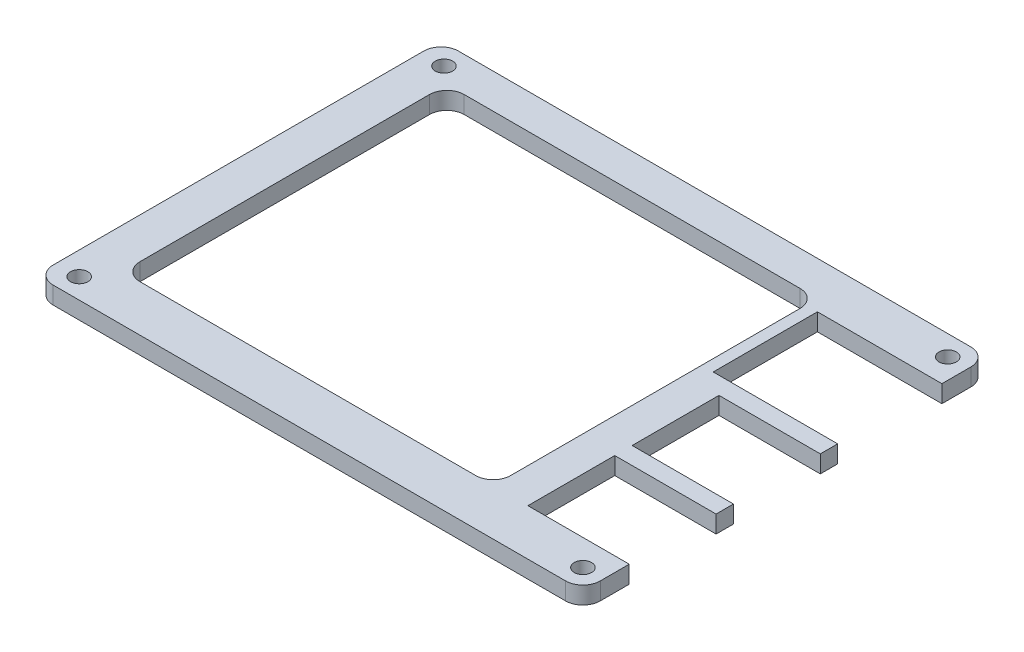
ISO-10303-21;
HEADER;
FILE_DESCRIPTION(('STEP AP214'),'2;1');
FILE_NAME('part.step','',(''),(''),'','','');
FILE_SCHEMA(('AUTOMOTIVE_DESIGN { 1 0 10303 214 1 1 1 1 }'));
ENDSEC;
DATA;
#1=APPLICATION_CONTEXT('core data for automotive mechanical design processes');
#2=APPLICATION_PROTOCOL_DEFINITION('international standard','automotive_design',2000,#1);
#3=PRODUCT_CONTEXT('',#1,'mechanical');
#4=PRODUCT('Part','Part','',(#3));
#5=PRODUCT_RELATED_PRODUCT_CATEGORY('part','',(#4));
#6=PRODUCT_DEFINITION_FORMATION('','',#4);
#7=PRODUCT_DEFINITION_CONTEXT('part definition',#1,'design');
#8=PRODUCT_DEFINITION('design','',#6,#7);
#9=PRODUCT_DEFINITION_SHAPE('','',#8);
#10=(LENGTH_UNIT() NAMED_UNIT(*) SI_UNIT(.MILLI.,.METRE.));
#11=(NAMED_UNIT(*) PLANE_ANGLE_UNIT() SI_UNIT($,.RADIAN.));
#12=(NAMED_UNIT(*) SI_UNIT($,.STERADIAN.) SOLID_ANGLE_UNIT());
#13=UNCERTAINTY_MEASURE_WITH_UNIT(LENGTH_MEASURE(1.E-05),#10,'distance_accuracy_value','');
#14=(GEOMETRIC_REPRESENTATION_CONTEXT(3) GLOBAL_UNCERTAINTY_ASSIGNED_CONTEXT((#13)) GLOBAL_UNIT_ASSIGNED_CONTEXT((#10,
#11,#12)) REPRESENTATION_CONTEXT('',''));
#15=CARTESIAN_POINT('',(0.,0.,0.));
#16=DIRECTION('',(0.,0.,1.));
#17=DIRECTION('',(1.,0.,0.));
#18=AXIS2_PLACEMENT_3D('',#15,#16,#17);
#19=CARTESIAN_POINT('',(47.25,3.,-35.));
#20=DIRECTION('',(-1.,0.,0.));
#21=DIRECTION('',(0.,0.,1.));
#22=AXIS2_PLACEMENT_3D('',#19,#20,#21);
#23=PLANE('',#22);
#24=DIRECTION('',(0.,0.,-1.));
#25=VECTOR('',#24,1.);
#26=CARTESIAN_POINT('',(47.25,0.,-35.));
#27=LINE('',#26,#25);
#28=CARTESIAN_POINT('',(47.25,0.,-5.99999999999998));
#29=VERTEX_POINT('',#28);
#30=CARTESIAN_POINT('',(47.25,0.,-8.99999999999998));
#31=VERTEX_POINT('',#30);
#32=EDGE_CURVE('E254',#29,#31,#27,.T.);
#33=ORIENTED_EDGE('',*,*,#32,.T.);
#34=DIRECTION('',(0.,1.,0.));
#35=VECTOR('',#34,1.);
#36=CARTESIAN_POINT('',(47.25,0.,-8.99999999999998));
#37=LINE('',#36,#35);
#38=CARTESIAN_POINT('',(47.25,3.,-8.99999999999998));
#39=VERTEX_POINT('',#38);
#40=EDGE_CURVE('E543',#31,#39,#37,.T.);
#41=ORIENTED_EDGE('',*,*,#40,.T.);
#42=DIRECTION('',(0.,0.,-1.));
#43=VECTOR('',#42,1.);
#44=CARTESIAN_POINT('',(47.25,3.,-35.));
#45=LINE('',#44,#43);
#46=CARTESIAN_POINT('',(47.25,3.,-5.99999999999998));
#47=VERTEX_POINT('',#46);
#48=EDGE_CURVE('E580',#47,#39,#45,.T.);
#49=ORIENTED_EDGE('',*,*,#48,.F.);
#50=DIRECTION('',(0.,1.,0.));
#51=VECTOR('',#50,1.);
#52=CARTESIAN_POINT('',(47.25,0.,-5.99999999999998));
#53=LINE('',#52,#51);
#54=EDGE_CURVE('E299',#29,#47,#53,.T.);
#55=ORIENTED_EDGE('',*,*,#54,.F.);
#56=EDGE_LOOP('',(#33,#41,#49,#55));
#57=FACE_BOUND('',#56,.T.);
#58=ADVANCED_FACE('F39',(#57),#23,.F.);
#59=CARTESIAN_POINT('',(47.25,0.,12.));
#60=VERTEX_POINT('',#59);
#61=CARTESIAN_POINT('',(47.25,0.,9.00000000000001));
#62=VERTEX_POINT('',#61);
#63=EDGE_CURVE('E261',#60,#62,#27,.T.);
#64=ORIENTED_EDGE('',*,*,#63,.T.);
#65=DIRECTION('',(0.,1.,0.));
#66=VECTOR('',#65,1.);
#67=CARTESIAN_POINT('',(47.25,0.,9.00000000000001));
#68=LINE('',#67,#66);
#69=CARTESIAN_POINT('',(47.25,3.,9.00000000000001));
#70=VERTEX_POINT('',#69);
#71=EDGE_CURVE('E285',#62,#70,#68,.T.);
#72=ORIENTED_EDGE('',*,*,#71,.T.);
#73=CARTESIAN_POINT('',(47.25,3.,12.));
#74=VERTEX_POINT('',#73);
#75=EDGE_CURVE('E392',#74,#70,#45,.T.);
#76=ORIENTED_EDGE('',*,*,#75,.F.);
#77=DIRECTION('',(0.,1.,0.));
#78=VECTOR('',#77,1.);
#79=CARTESIAN_POINT('',(47.25,0.,12.));
#80=LINE('',#79,#78);
#81=EDGE_CURVE('E287',#60,#74,#80,.T.);
#82=ORIENTED_EDGE('',*,*,#81,.F.);
#83=EDGE_LOOP('',(#64,#72,#76,#82));
#84=FACE_BOUND('',#83,.T.);
#85=ADVANCED_FACE('F283',(#84),#23,.F.);
#86=CARTESIAN_POINT('',(47.25,0.,32.));
#87=VERTEX_POINT('',#86);
#88=CARTESIAN_POINT('',(47.25,0.,27.));
#89=VERTEX_POINT('',#88);
#90=EDGE_CURVE('E257',#87,#89,#27,.T.);
#91=ORIENTED_EDGE('',*,*,#90,.T.);
#92=DIRECTION('',(0.,1.,0.));
#93=VECTOR('',#92,1.);
#94=CARTESIAN_POINT('',(47.25,0.,27.));
#95=LINE('',#94,#93);
#96=CARTESIAN_POINT('',(47.25,3.,27.));
#97=VERTEX_POINT('',#96);
#98=EDGE_CURVE('E314',#89,#97,#95,.T.);
#99=ORIENTED_EDGE('',*,*,#98,.T.);
#100=CARTESIAN_POINT('',(47.25,3.,32.));
#101=VERTEX_POINT('',#100);
#102=EDGE_CURVE('E387',#101,#97,#45,.T.);
#103=ORIENTED_EDGE('',*,*,#102,.F.);
#104=DIRECTION('',(0.,-1.,0.));
#105=VECTOR('',#104,1.);
#106=CARTESIAN_POINT('',(47.25,3.,32.));
#107=LINE('',#106,#105);
#108=EDGE_CURVE('E456',#101,#87,#107,.T.);
#109=ORIENTED_EDGE('',*,*,#108,.T.);
#110=EDGE_LOOP('',(#91,#99,#103,#109));
#111=FACE_BOUND('',#110,.T.);
#112=ADVANCED_FACE('F605',(#111),#23,.F.);
#113=CARTESIAN_POINT('',(47.25,3.,-27.));
#114=VERTEX_POINT('',#113);
#115=CARTESIAN_POINT('',(47.25,3.,-32.));
#116=VERTEX_POINT('',#115);
#117=EDGE_CURVE('E245',#114,#116,#45,.T.);
#118=ORIENTED_EDGE('',*,*,#117,.F.);
#119=DIRECTION('',(0.,1.,0.));
#120=VECTOR('',#119,1.);
#121=CARTESIAN_POINT('',(47.25,0.,-27.));
#122=LINE('',#121,#120);
#123=CARTESIAN_POINT('',(47.25,0.,-27.));
#124=VERTEX_POINT('',#123);
#125=EDGE_CURVE('E229',#124,#114,#122,.T.);
#126=ORIENTED_EDGE('',*,*,#125,.F.);
#127=CARTESIAN_POINT('',(47.25,0.,-32.));
#128=VERTEX_POINT('',#127);
#129=EDGE_CURVE('E243',#124,#128,#27,.T.);
#130=ORIENTED_EDGE('',*,*,#129,.T.);
#131=DIRECTION('',(0.,-1.,0.));
#132=VECTOR('',#131,1.);
#133=CARTESIAN_POINT('',(47.25,3.,-32.));
#134=LINE('',#133,#132);
#135=EDGE_CURVE('E459',#128,#116,#134,.F.);
#136=ORIENTED_EDGE('',*,*,#135,.T.);
#137=EDGE_LOOP('',(#118,#126,#130,#136));
#138=FACE_BOUND('',#137,.T.);
#139=ADVANCED_FACE('F241',(#138),#23,.F.);
#140=CARTESIAN_POINT('',(-47.25,3.,-35.));
#141=DIRECTION('',(0.,0.,1.));
#142=DIRECTION('',(1.,0.,0.));
#143=AXIS2_PLACEMENT_3D('',#140,#141,#142);
#144=PLANE('',#143);
#145=DIRECTION('',(-1.,0.,0.));
#146=VECTOR('',#145,1.);
#147=CARTESIAN_POINT('',(-47.25,0.,-35.));
#148=LINE('',#147,#146);
#149=CARTESIAN_POINT('',(44.25,0.,-35.));
#150=VERTEX_POINT('',#149);
#151=CARTESIAN_POINT('',(-44.25,0.,-35.));
#152=VERTEX_POINT('',#151);
#153=EDGE_CURVE('E269',#150,#152,#148,.T.);
#154=ORIENTED_EDGE('',*,*,#153,.T.);
#155=DIRECTION('',(0.,-1.,0.));
#156=VECTOR('',#155,1.);
#157=CARTESIAN_POINT('',(-44.25,3.,-35.));
#158=LINE('',#157,#156);
#159=CARTESIAN_POINT('',(-44.25,3.,-35.));
#160=VERTEX_POINT('',#159);
#161=EDGE_CURVE('E453',#152,#160,#158,.F.);
#162=ORIENTED_EDGE('',*,*,#161,.T.);
#163=DIRECTION('',(-1.,0.,0.));
#164=VECTOR('',#163,1.);
#165=CARTESIAN_POINT('',(-47.25,3.,-35.));
#166=LINE('',#165,#164);
#167=CARTESIAN_POINT('',(44.25,3.,-35.));
#168=VERTEX_POINT('',#167);
#169=EDGE_CURVE('E391',#168,#160,#166,.T.);
#170=ORIENTED_EDGE('',*,*,#169,.F.);
#171=DIRECTION('',(0.,-1.,0.));
#172=VECTOR('',#171,1.);
#173=CARTESIAN_POINT('',(44.25,3.,-35.));
#174=LINE('',#173,#172);
#175=EDGE_CURVE('E449',#168,#150,#174,.T.);
#176=ORIENTED_EDGE('',*,*,#175,.T.);
#177=EDGE_LOOP('',(#154,#162,#170,#176));
#178=FACE_BOUND('',#177,.T.);
#179=ADVANCED_FACE('F639',(#178),#144,.F.);
#180=CARTESIAN_POINT('',(-47.25,3.,-35.));
#181=DIRECTION('',(1.,0.,0.));
#182=DIRECTION('',(0.,0.,-1.));
#183=AXIS2_PLACEMENT_3D('',#180,#181,#182);
#184=PLANE('',#183);
#185=DIRECTION('',(0.,0.,1.));
#186=VECTOR('',#185,1.);
#187=CARTESIAN_POINT('',(-47.25,0.,-35.));
#188=LINE('',#187,#186);
#189=CARTESIAN_POINT('',(-47.25,0.,-32.));
#190=VERTEX_POINT('',#189);
#191=CARTESIAN_POINT('',(-47.25,0.,32.));
#192=VERTEX_POINT('',#191);
#193=EDGE_CURVE('E277',#190,#192,#188,.T.);
#194=ORIENTED_EDGE('',*,*,#193,.T.);
#195=DIRECTION('',(0.,-1.,0.));
#196=VECTOR('',#195,1.);
#197=CARTESIAN_POINT('',(-47.25,3.,32.));
#198=LINE('',#197,#196);
#199=CARTESIAN_POINT('',(-47.25,3.,32.));
#200=VERTEX_POINT('',#199);
#201=EDGE_CURVE('E434',#192,#200,#198,.F.);
#202=ORIENTED_EDGE('',*,*,#201,.T.);
#203=DIRECTION('',(0.,0.,1.));
#204=VECTOR('',#203,1.);
#205=CARTESIAN_POINT('',(-47.25,3.,-35.));
#206=LINE('',#205,#204);
#207=CARTESIAN_POINT('',(-47.25,3.,-32.));
#208=VERTEX_POINT('',#207);
#209=EDGE_CURVE('E396',#208,#200,#206,.T.);
#210=ORIENTED_EDGE('',*,*,#209,.F.);
#211=DIRECTION('',(0.,-1.,0.));
#212=VECTOR('',#211,1.);
#213=CARTESIAN_POINT('',(-47.25,3.,-32.));
#214=LINE('',#213,#212);
#215=EDGE_CURVE('E430',#208,#190,#214,.T.);
#216=ORIENTED_EDGE('',*,*,#215,.T.);
#217=EDGE_LOOP('',(#194,#202,#210,#216));
#218=FACE_BOUND('',#217,.T.);
#219=ADVANCED_FACE('F592',(#218),#184,.F.);
#220=CARTESIAN_POINT('',(-47.25,3.,35.));
#221=DIRECTION('',(0.,0.,-1.));
#222=DIRECTION('',(-1.,0.,0.));
#223=AXIS2_PLACEMENT_3D('',#220,#221,#222);
#224=PLANE('',#223);
#225=DIRECTION('',(1.,0.,0.));
#226=VECTOR('',#225,1.);
#227=CARTESIAN_POINT('',(-47.25,3.,35.));
#228=LINE('',#227,#226);
#229=CARTESIAN_POINT('',(-44.25,3.,35.));
#230=VERTEX_POINT('',#229);
#231=CARTESIAN_POINT('',(44.25,3.,35.));
#232=VERTEX_POINT('',#231);
#233=EDGE_CURVE('E399',#230,#232,#228,.T.);
#234=ORIENTED_EDGE('',*,*,#233,.F.);
#235=DIRECTION('',(0.,-1.,0.));
#236=VECTOR('',#235,1.);
#237=CARTESIAN_POINT('',(-44.25,3.,35.));
#238=LINE('',#237,#236);
#239=CARTESIAN_POINT('',(-44.25,0.,35.));
#240=VERTEX_POINT('',#239);
#241=EDGE_CURVE('E407',#230,#240,#238,.T.);
#242=ORIENTED_EDGE('',*,*,#241,.T.);
#243=DIRECTION('',(1.,0.,0.));
#244=VECTOR('',#243,1.);
#245=CARTESIAN_POINT('',(-47.25,0.,35.));
#246=LINE('',#245,#244);
#247=CARTESIAN_POINT('',(44.25,0.,35.));
#248=VERTEX_POINT('',#247);
#249=EDGE_CURVE('E417',#240,#248,#246,.T.);
#250=ORIENTED_EDGE('',*,*,#249,.T.);
#251=DIRECTION('',(0.,-1.,0.));
#252=VECTOR('',#251,1.);
#253=CARTESIAN_POINT('',(44.25,3.,35.));
#254=LINE('',#253,#252);
#255=EDGE_CURVE('E402',#248,#232,#254,.F.);
#256=ORIENTED_EDGE('',*,*,#255,.T.);
#257=EDGE_LOOP('',(#234,#242,#250,#256));
#258=FACE_BOUND('',#257,.T.);
#259=ADVANCED_FACE('F600',(#258),#224,.F.);
#260=CARTESIAN_POINT('',(0.,3.,0.));
#261=DIRECTION('',(0.,1.,0.));
#262=DIRECTION('',(0.,0.,1.));
#263=AXIS2_PLACEMENT_3D('',#260,#261,#262);
#264=PLANE('',#263);
#265=DIRECTION('',(0.,0.,1.));
#266=VECTOR('',#265,1.);
#267=CARTESIAN_POINT('',(-40.25,3.,27.));
#268=LINE('',#267,#266);
#269=CARTESIAN_POINT('',(-40.25,3.,-26.));
#270=VERTEX_POINT('',#269);
#271=CARTESIAN_POINT('',(-40.25,3.,24.));
#272=VERTEX_POINT('',#271);
#273=EDGE_CURVE('E513',#270,#272,#268,.T.);
#274=ORIENTED_EDGE('',*,*,#273,.F.);
#275=CARTESIAN_POINT('',(-37.25,3.,-26.));
#276=DIRECTION('',(0.,1.,0.));
#277=DIRECTION('',(0.,0.,1.));
#278=AXIS2_PLACEMENT_3D('',#275,#276,#277);
#279=CIRCLE('',#278,3.);
#280=CARTESIAN_POINT('',(-37.25,3.,-29.));
#281=VERTEX_POINT('',#280);
#282=EDGE_CURVE('E48',#270,#281,#279,.F.);
#283=ORIENTED_EDGE('',*,*,#282,.T.);
#284=DIRECTION('',(-1.,0.,0.));
#285=VECTOR('',#284,1.);
#286=CARTESIAN_POINT('',(-40.25,3.,-29.));
#287=LINE('',#286,#285);
#288=CARTESIAN_POINT('',(20.75,3.,-29.));
#289=VERTEX_POINT('',#288);
#290=EDGE_CURVE('E512',#289,#281,#287,.T.);
#291=ORIENTED_EDGE('',*,*,#290,.F.);
#292=CARTESIAN_POINT('',(20.75,3.,-26.));
#293=DIRECTION('',(0.,1.,0.));
#294=DIRECTION('',(0.,0.,1.));
#295=AXIS2_PLACEMENT_3D('',#292,#293,#294);
#296=CIRCLE('',#295,3.);
#297=CARTESIAN_POINT('',(23.75,3.,-26.));
#298=VERTEX_POINT('',#297);
#299=EDGE_CURVE('E489',#289,#298,#296,.F.);
#300=ORIENTED_EDGE('',*,*,#299,.T.);
#301=DIRECTION('',(0.,0.,-1.));
#302=VECTOR('',#301,1.);
#303=CARTESIAN_POINT('',(23.75,3.,-29.));
#304=LINE('',#303,#302);
#305=CARTESIAN_POINT('',(23.75,3.,24.));
#306=VERTEX_POINT('',#305);
#307=EDGE_CURVE('E523',#306,#298,#304,.T.);
#308=ORIENTED_EDGE('',*,*,#307,.F.);
#309=CARTESIAN_POINT('',(20.75,3.,24.));
#310=DIRECTION('',(0.,1.,0.));
#311=DIRECTION('',(0.,0.,1.));
#312=AXIS2_PLACEMENT_3D('',#309,#310,#311);
#313=CIRCLE('',#312,3.);
#314=CARTESIAN_POINT('',(20.75,3.,27.));
#315=VERTEX_POINT('',#314);
#316=EDGE_CURVE('E495',#306,#315,#313,.F.);
#317=ORIENTED_EDGE('',*,*,#316,.T.);
#318=DIRECTION('',(1.,0.,0.));
#319=VECTOR('',#318,1.);
#320=CARTESIAN_POINT('',(23.75,3.,27.));
#321=LINE('',#320,#319);
#322=CARTESIAN_POINT('',(-37.25,3.,27.));
#323=VERTEX_POINT('',#322);
#324=EDGE_CURVE('E542',#323,#315,#321,.T.);
#325=ORIENTED_EDGE('',*,*,#324,.F.);
#326=CARTESIAN_POINT('',(-37.25,3.,24.));
#327=DIRECTION('',(0.,1.,0.));
#328=DIRECTION('',(0.,0.,1.));
#329=AXIS2_PLACEMENT_3D('',#326,#327,#328);
#330=CIRCLE('',#329,3.);
#331=EDGE_CURVE('E501',#323,#272,#330,.F.);
#332=ORIENTED_EDGE('',*,*,#331,.T.);
#333=EDGE_LOOP('',(#274,#283,#291,#300,#308,#317,#325,#332));
#334=FACE_BOUND('',#333,.T.);
#335=DIRECTION('',(1.,0.,0.));
#336=VECTOR('',#335,1.);
#337=CARTESIAN_POINT('',(25.75,3.,-8.99999999999998));
#338=LINE('',#337,#336);
#339=CARTESIAN_POINT('',(25.75,3.,-8.99999999999998));
#340=VERTEX_POINT('',#339);
#341=EDGE_CURVE('E237',#340,#39,#338,.T.);
#342=ORIENTED_EDGE('',*,*,#341,.F.);
#343=DIRECTION('',(0.,0.,1.));
#344=VECTOR('',#343,1.);
#345=CARTESIAN_POINT('',(25.75,3.,-27.));
#346=LINE('',#345,#344);
#347=CARTESIAN_POINT('',(25.75,3.,-27.));
#348=VERTEX_POINT('',#347);
#349=EDGE_CURVE('E557',#348,#340,#346,.T.);
#350=ORIENTED_EDGE('',*,*,#349,.F.);
#351=DIRECTION('',(-1.,0.,0.));
#352=VECTOR('',#351,1.);
#353=CARTESIAN_POINT('',(47.25,3.,-27.));
#354=LINE('',#353,#352);
#355=EDGE_CURVE('E323',#114,#348,#354,.T.);
#356=ORIENTED_EDGE('',*,*,#355,.F.);
#357=ORIENTED_EDGE('',*,*,#117,.T.);
#358=CARTESIAN_POINT('',(44.25,3.,-32.));
#359=DIRECTION('',(0.,1.,0.));
#360=DIRECTION('',(0.,0.,1.));
#361=AXIS2_PLACEMENT_3D('',#358,#359,#360);
#362=CIRCLE('',#361,3.);
#363=EDGE_CURVE('E440',#116,#168,#362,.T.);
#364=ORIENTED_EDGE('',*,*,#363,.T.);
#365=ORIENTED_EDGE('',*,*,#169,.T.);
#366=CARTESIAN_POINT('',(-44.25,3.,-32.));
#367=DIRECTION('',(0.,1.,0.));
#368=DIRECTION('',(0.,0.,1.));
#369=AXIS2_PLACEMENT_3D('',#366,#367,#368);
#370=CIRCLE('',#369,3.);
#371=EDGE_CURVE('E443',#160,#208,#370,.T.);
#372=ORIENTED_EDGE('',*,*,#371,.T.);
#373=ORIENTED_EDGE('',*,*,#209,.T.);
#374=CARTESIAN_POINT('',(-44.25,3.,32.));
#375=DIRECTION('',(0.,1.,0.));
#376=DIRECTION('',(0.,0.,1.));
#377=AXIS2_PLACEMENT_3D('',#374,#375,#376);
#378=CIRCLE('',#377,3.);
#379=EDGE_CURVE('E446',#200,#230,#378,.T.);
#380=ORIENTED_EDGE('',*,*,#379,.T.);
#381=ORIENTED_EDGE('',*,*,#233,.T.);
#382=CARTESIAN_POINT('',(44.25,3.,32.));
#383=DIRECTION('',(0.,1.,0.));
#384=DIRECTION('',(0.,0.,1.));
#385=AXIS2_PLACEMENT_3D('',#382,#383,#384);
#386=CIRCLE('',#385,3.);
#387=EDGE_CURVE('E437',#232,#101,#386,.T.);
#388=ORIENTED_EDGE('',*,*,#387,.T.);
#389=ORIENTED_EDGE('',*,*,#102,.T.);
#390=DIRECTION('',(1.,0.,0.));
#391=VECTOR('',#390,1.);
#392=CARTESIAN_POINT('',(29.75,3.,27.));
#393=LINE('',#392,#391);
#394=CARTESIAN_POINT('',(29.75,3.,27.));
#395=VERTEX_POINT('',#394);
#396=EDGE_CURVE('E332',#395,#97,#393,.T.);
#397=ORIENTED_EDGE('',*,*,#396,.F.);
#398=DIRECTION('',(0.,0.,1.));
#399=VECTOR('',#398,1.);
#400=CARTESIAN_POINT('',(29.75,3.,12.));
#401=LINE('',#400,#399);
#402=CARTESIAN_POINT('',(29.75,3.,12.));
#403=VERTEX_POINT('',#402);
#404=EDGE_CURVE('E343',#403,#395,#401,.T.);
#405=ORIENTED_EDGE('',*,*,#404,.F.);
#406=DIRECTION('',(-1.,0.,0.));
#407=VECTOR('',#406,1.);
#408=CARTESIAN_POINT('',(47.25,3.,12.));
#409=LINE('',#408,#407);
#410=EDGE_CURVE('E339',#74,#403,#409,.T.);
#411=ORIENTED_EDGE('',*,*,#410,.F.);
#412=ORIENTED_EDGE('',*,*,#75,.T.);
#413=DIRECTION('',(1.,0.,0.));
#414=VECTOR('',#413,1.);
#415=CARTESIAN_POINT('',(29.75,3.,9.00000000000002));
#416=LINE('',#415,#414);
#417=CARTESIAN_POINT('',(29.75,3.,9.00000000000002));
#418=VERTEX_POINT('',#417);
#419=EDGE_CURVE('E318',#418,#70,#416,.T.);
#420=ORIENTED_EDGE('',*,*,#419,.F.);
#421=DIRECTION('',(0.,0.,1.));
#422=VECTOR('',#421,1.);
#423=CARTESIAN_POINT('',(29.75,3.,-5.99999999999998));
#424=LINE('',#423,#422);
#425=CARTESIAN_POINT('',(29.75,3.,-5.99999999999998));
#426=VERTEX_POINT('',#425);
#427=EDGE_CURVE('E313',#426,#418,#424,.T.);
#428=ORIENTED_EDGE('',*,*,#427,.F.);
#429=DIRECTION('',(-1.,0.,0.));
#430=VECTOR('',#429,1.);
#431=CARTESIAN_POINT('',(47.25,3.,-5.99999999999998));
#432=LINE('',#431,#430);
#433=EDGE_CURVE('E309',#47,#426,#432,.T.);
#434=ORIENTED_EDGE('',*,*,#433,.F.);
#435=ORIENTED_EDGE('',*,*,#48,.T.);
#436=EDGE_LOOP('',(#342,#350,#356,#357,#364,#365,#372,#373,#380,#381,#388,#389,#397,#405,#411,
#412,#420,#428,#434,#435));
#437=FACE_BOUND('',#436,.T.);
#438=CARTESIAN_POINT('',(43.75,3.,31.5));
#439=DIRECTION('',(0.,1.,0.));
#440=DIRECTION('',(0.,0.,1.));
#441=AXIS2_PLACEMENT_3D('',#438,#439,#440);
#442=CIRCLE('',#441,1.5);
#443=CARTESIAN_POINT('',(43.75,3.,33.));
#444=VERTEX_POINT('',#443);
#445=EDGE_CURVE('E379',#444,#444,#442,.T.);
#446=ORIENTED_EDGE('',*,*,#445,.F.);
#447=EDGE_LOOP('',(#446));
#448=FACE_BOUND('',#447,.T.);
#449=CARTESIAN_POINT('',(-43.25,3.,31.5));
#450=DIRECTION('',(0.,1.,0.));
#451=DIRECTION('',(0.,0.,1.));
#452=AXIS2_PLACEMENT_3D('',#449,#450,#451);
#453=CIRCLE('',#452,1.5);
#454=CARTESIAN_POINT('',(-43.25,3.,33.));
#455=VERTEX_POINT('',#454);
#456=EDGE_CURVE('E371',#455,#455,#453,.T.);
#457=ORIENTED_EDGE('',*,*,#456,.F.);
#458=EDGE_LOOP('',(#457));
#459=FACE_BOUND('',#458,.T.);
#460=CARTESIAN_POINT('',(-43.25,3.,-31.5));
#461=DIRECTION('',(0.,1.,0.));
#462=DIRECTION('',(0.,0.,1.));
#463=AXIS2_PLACEMENT_3D('',#460,#461,#462);
#464=CIRCLE('',#463,1.5);
#465=CARTESIAN_POINT('',(-43.25,3.,-30.));
#466=VERTEX_POINT('',#465);
#467=EDGE_CURVE('E363',#466,#466,#464,.T.);
#468=ORIENTED_EDGE('',*,*,#467,.F.);
#469=EDGE_LOOP('',(#468));
#470=FACE_BOUND('',#469,.T.);
#471=CARTESIAN_POINT('',(43.75,3.,-31.5));
#472=DIRECTION('',(0.,1.,0.));
#473=DIRECTION('',(0.,0.,1.));
#474=AXIS2_PLACEMENT_3D('',#471,#472,#473);
#475=CIRCLE('',#474,1.5);
#476=CARTESIAN_POINT('',(43.75,3.,-30.));
#477=VERTEX_POINT('',#476);
#478=EDGE_CURVE('E263',#477,#477,#475,.T.);
#479=ORIENTED_EDGE('',*,*,#478,.F.);
#480=EDGE_LOOP('',(#479));
#481=FACE_BOUND('',#480,.T.);
#482=ADVANCED_FACE('F511',(#334,#437,#448,#459,#470,#481),#264,.T.);
#483=CARTESIAN_POINT('',(0.,0.,0.));
#484=DIRECTION('',(0.,1.,0.));
#485=DIRECTION('',(0.,0.,1.));
#486=AXIS2_PLACEMENT_3D('',#483,#484,#485);
#487=PLANE('',#486);
#488=DIRECTION('',(0.,0.,-1.));
#489=VECTOR('',#488,1.);
#490=CARTESIAN_POINT('',(23.75,0.,-29.));
#491=LINE('',#490,#489);
#492=CARTESIAN_POINT('',(23.75,0.,24.));
#493=VERTEX_POINT('',#492);
#494=CARTESIAN_POINT('',(23.75,0.,-26.));
#495=VERTEX_POINT('',#494);
#496=EDGE_CURVE('E532',#493,#495,#491,.T.);
#497=ORIENTED_EDGE('',*,*,#496,.T.);
#498=CARTESIAN_POINT('',(20.75,0.,-26.));
#499=DIRECTION('',(0.,1.,0.));
#500=DIRECTION('',(0.,0.,1.));
#501=AXIS2_PLACEMENT_3D('',#498,#499,#500);
#502=CIRCLE('',#501,3.);
#503=CARTESIAN_POINT('',(20.75,0.,-29.));
#504=VERTEX_POINT('',#503);
#505=EDGE_CURVE('E492',#495,#504,#502,.T.);
#506=ORIENTED_EDGE('',*,*,#505,.T.);
#507=DIRECTION('',(-1.,0.,0.));
#508=VECTOR('',#507,1.);
#509=CARTESIAN_POINT('',(-40.25,0.,-29.));
#510=LINE('',#509,#508);
#511=CARTESIAN_POINT('',(-37.25,0.,-29.));
#512=VERTEX_POINT('',#511);
#513=EDGE_CURVE('E382',#504,#512,#510,.T.);
#514=ORIENTED_EDGE('',*,*,#513,.T.);
#515=CARTESIAN_POINT('',(-37.25,0.,-26.));
#516=DIRECTION('',(0.,1.,0.));
#517=DIRECTION('',(0.,0.,1.));
#518=AXIS2_PLACEMENT_3D('',#515,#516,#517);
#519=CIRCLE('',#518,3.);
#520=CARTESIAN_POINT('',(-40.25,0.,-26.));
#521=VERTEX_POINT('',#520);
#522=EDGE_CURVE('E11',#512,#521,#519,.T.);
#523=ORIENTED_EDGE('',*,*,#522,.T.);
#524=DIRECTION('',(0.,0.,1.));
#525=VECTOR('',#524,1.);
#526=CARTESIAN_POINT('',(-40.25,0.,27.));
#527=LINE('',#526,#525);
#528=CARTESIAN_POINT('',(-40.25,0.,24.));
#529=VERTEX_POINT('',#528);
#530=EDGE_CURVE('E522',#521,#529,#527,.T.);
#531=ORIENTED_EDGE('',*,*,#530,.T.);
#532=CARTESIAN_POINT('',(-37.25,0.,24.));
#533=DIRECTION('',(0.,1.,0.));
#534=DIRECTION('',(0.,0.,1.));
#535=AXIS2_PLACEMENT_3D('',#532,#533,#534);
#536=CIRCLE('',#535,3.);
#537=CARTESIAN_POINT('',(-37.25,0.,27.));
#538=VERTEX_POINT('',#537);
#539=EDGE_CURVE('E504',#529,#538,#536,.T.);
#540=ORIENTED_EDGE('',*,*,#539,.T.);
#541=DIRECTION('',(1.,0.,0.));
#542=VECTOR('',#541,1.);
#543=CARTESIAN_POINT('',(23.75,0.,27.));
#544=LINE('',#543,#542);
#545=CARTESIAN_POINT('',(20.75,0.,27.));
#546=VERTEX_POINT('',#545);
#547=EDGE_CURVE('E528',#538,#546,#544,.T.);
#548=ORIENTED_EDGE('',*,*,#547,.T.);
#549=CARTESIAN_POINT('',(20.75,0.,24.));
#550=DIRECTION('',(0.,1.,0.));
#551=DIRECTION('',(0.,0.,1.));
#552=AXIS2_PLACEMENT_3D('',#549,#550,#551);
#553=CIRCLE('',#552,3.);
#554=EDGE_CURVE('E498',#546,#493,#553,.T.);
#555=ORIENTED_EDGE('',*,*,#554,.T.);
#556=EDGE_LOOP('',(#497,#506,#514,#523,#531,#540,#548,#555));
#557=FACE_BOUND('',#556,.T.);
#558=CARTESIAN_POINT('',(43.75,0.,31.5));
#559=DIRECTION('',(0.,1.,0.));
#560=DIRECTION('',(0.,0.,1.));
#561=AXIS2_PLACEMENT_3D('',#558,#559,#560);
#562=CIRCLE('',#561,1.5);
#563=CARTESIAN_POINT('',(43.75,0.,33.));
#564=VERTEX_POINT('',#563);
#565=EDGE_CURVE('E375',#564,#564,#562,.T.);
#566=ORIENTED_EDGE('',*,*,#565,.T.);
#567=EDGE_LOOP('',(#566));
#568=FACE_BOUND('',#567,.T.);
#569=CARTESIAN_POINT('',(-43.25,0.,31.5));
#570=DIRECTION('',(0.,1.,0.));
#571=DIRECTION('',(0.,0.,1.));
#572=AXIS2_PLACEMENT_3D('',#569,#570,#571);
#573=CIRCLE('',#572,1.5);
#574=CARTESIAN_POINT('',(-43.25,0.,33.));
#575=VERTEX_POINT('',#574);
#576=EDGE_CURVE('E367',#575,#575,#573,.T.);
#577=ORIENTED_EDGE('',*,*,#576,.T.);
#578=EDGE_LOOP('',(#577));
#579=FACE_BOUND('',#578,.T.);
#580=CARTESIAN_POINT('',(-43.25,0.,-31.5));
#581=DIRECTION('',(0.,1.,0.));
#582=DIRECTION('',(0.,0.,1.));
#583=AXIS2_PLACEMENT_3D('',#580,#581,#582);
#584=CIRCLE('',#583,1.5);
#585=CARTESIAN_POINT('',(-43.25,0.,-30.));
#586=VERTEX_POINT('',#585);
#587=EDGE_CURVE('E359',#586,#586,#584,.T.);
#588=ORIENTED_EDGE('',*,*,#587,.T.);
#589=EDGE_LOOP('',(#588));
#590=FACE_BOUND('',#589,.T.);
#591=CARTESIAN_POINT('',(43.75,0.,-31.5));
#592=DIRECTION('',(0.,1.,0.));
#593=DIRECTION('',(0.,0.,1.));
#594=AXIS2_PLACEMENT_3D('',#591,#592,#593);
#595=CIRCLE('',#594,1.5);
#596=CARTESIAN_POINT('',(43.75,0.,-30.));
#597=VERTEX_POINT('',#596);
#598=EDGE_CURVE('E255',#597,#597,#595,.T.);
#599=ORIENTED_EDGE('',*,*,#598,.T.);
#600=EDGE_LOOP('',(#599));
#601=FACE_BOUND('',#600,.T.);
#602=DIRECTION('',(0.,0.,1.));
#603=VECTOR('',#602,1.);
#604=CARTESIAN_POINT('',(25.75,0.,-27.));
#605=LINE('',#604,#603);
#606=CARTESIAN_POINT('',(25.75,0.,-27.));
#607=VERTEX_POINT('',#606);
#608=CARTESIAN_POINT('',(25.75,0.,-8.99999999999998));
#609=VERTEX_POINT('',#608);
#610=EDGE_CURVE('E236',#607,#609,#605,.T.);
#611=ORIENTED_EDGE('',*,*,#610,.T.);
#612=DIRECTION('',(1.,0.,0.));
#613=VECTOR('',#612,1.);
#614=CARTESIAN_POINT('',(25.75,0.,-8.99999999999998));
#615=LINE('',#614,#613);
#616=EDGE_CURVE('E247',#609,#31,#615,.T.);
#617=ORIENTED_EDGE('',*,*,#616,.T.);
#618=ORIENTED_EDGE('',*,*,#32,.F.);
#619=DIRECTION('',(-1.,0.,0.));
#620=VECTOR('',#619,1.);
#621=CARTESIAN_POINT('',(47.25,0.,-5.99999999999998));
#622=LINE('',#621,#620);
#623=CARTESIAN_POINT('',(29.75,0.,-5.99999999999998));
#624=VERTEX_POINT('',#623);
#625=EDGE_CURVE('E305',#29,#624,#622,.T.);
#626=ORIENTED_EDGE('',*,*,#625,.T.);
#627=DIRECTION('',(0.,0.,1.));
#628=VECTOR('',#627,1.);
#629=CARTESIAN_POINT('',(29.75,0.,-5.99999999999998));
#630=LINE('',#629,#628);
#631=CARTESIAN_POINT('',(29.75,0.,9.00000000000002));
#632=VERTEX_POINT('',#631);
#633=EDGE_CURVE('E296',#624,#632,#630,.T.);
#634=ORIENTED_EDGE('',*,*,#633,.T.);
#635=DIRECTION('',(1.,0.,0.));
#636=VECTOR('',#635,1.);
#637=CARTESIAN_POINT('',(29.75,0.,9.00000000000002));
#638=LINE('',#637,#636);
#639=EDGE_CURVE('E294',#632,#62,#638,.T.);
#640=ORIENTED_EDGE('',*,*,#639,.T.);
#641=ORIENTED_EDGE('',*,*,#63,.F.);
#642=DIRECTION('',(-1.,0.,0.));
#643=VECTOR('',#642,1.);
#644=CARTESIAN_POINT('',(47.25,0.,12.));
#645=LINE('',#644,#643);
#646=CARTESIAN_POINT('',(29.75,0.,12.));
#647=VERTEX_POINT('',#646);
#648=EDGE_CURVE('E291',#60,#647,#645,.T.);
#649=ORIENTED_EDGE('',*,*,#648,.T.);
#650=DIRECTION('',(0.,0.,1.));
#651=VECTOR('',#650,1.);
#652=CARTESIAN_POINT('',(29.75,0.,12.));
#653=LINE('',#652,#651);
#654=CARTESIAN_POINT('',(29.75,0.,27.));
#655=VERTEX_POINT('',#654);
#656=EDGE_CURVE('E331',#647,#655,#653,.T.);
#657=ORIENTED_EDGE('',*,*,#656,.T.);
#658=DIRECTION('',(1.,0.,0.));
#659=VECTOR('',#658,1.);
#660=CARTESIAN_POINT('',(29.75,0.,27.));
#661=LINE('',#660,#659);
#662=EDGE_CURVE('E335',#655,#89,#661,.T.);
#663=ORIENTED_EDGE('',*,*,#662,.T.);
#664=ORIENTED_EDGE('',*,*,#90,.F.);
#665=CARTESIAN_POINT('',(44.25,0.,32.));
#666=DIRECTION('',(0.,1.,0.));
#667=DIRECTION('',(0.,0.,1.));
#668=AXIS2_PLACEMENT_3D('',#665,#666,#667);
#669=CIRCLE('',#668,3.);
#670=EDGE_CURVE('E414',#87,#248,#669,.F.);
#671=ORIENTED_EDGE('',*,*,#670,.T.);
#672=ORIENTED_EDGE('',*,*,#249,.F.);
#673=CARTESIAN_POINT('',(-44.25,0.,32.));
#674=DIRECTION('',(0.,1.,0.));
#675=DIRECTION('',(0.,0.,1.));
#676=AXIS2_PLACEMENT_3D('',#673,#674,#675);
#677=CIRCLE('',#676,3.);
#678=EDGE_CURVE('E427',#240,#192,#677,.F.);
#679=ORIENTED_EDGE('',*,*,#678,.T.);
#680=ORIENTED_EDGE('',*,*,#193,.F.);
#681=CARTESIAN_POINT('',(-44.25,0.,-32.));
#682=DIRECTION('',(0.,1.,0.));
#683=DIRECTION('',(0.,0.,1.));
#684=AXIS2_PLACEMENT_3D('',#681,#682,#683);
#685=CIRCLE('',#684,3.);
#686=EDGE_CURVE('E424',#190,#152,#685,.F.);
#687=ORIENTED_EDGE('',*,*,#686,.T.);
#688=ORIENTED_EDGE('',*,*,#153,.F.);
#689=CARTESIAN_POINT('',(44.25,0.,-32.));
#690=DIRECTION('',(0.,1.,0.));
#691=DIRECTION('',(0.,0.,1.));
#692=AXIS2_PLACEMENT_3D('',#689,#690,#691);
#693=CIRCLE('',#692,3.);
#694=EDGE_CURVE('E251',#150,#128,#693,.F.);
#695=ORIENTED_EDGE('',*,*,#694,.T.);
#696=ORIENTED_EDGE('',*,*,#129,.F.);
#697=DIRECTION('',(-1.,0.,0.));
#698=VECTOR('',#697,1.);
#699=CARTESIAN_POINT('',(47.25,0.,-27.));
#700=LINE('',#699,#698);
#701=EDGE_CURVE('E225',#124,#607,#700,.T.);
#702=ORIENTED_EDGE('',*,*,#701,.T.);
#703=EDGE_LOOP('',(#611,#617,#618,#626,#634,#640,#641,#649,#657,#663,#664,#671,#672,#679,#680,
#687,#688,#695,#696,#702));
#704=FACE_BOUND('',#703,.T.);
#705=ADVANCED_FACE('F249',(#557,#568,#579,#590,#601,#704),#487,.F.);
#706=CARTESIAN_POINT('',(43.75,0.,-31.5));
#707=DIRECTION('',(0.,1.,0.));
#708=DIRECTION('',(0.,0.,1.));
#709=AXIS2_PLACEMENT_3D('',#706,#707,#708);
#710=CYLINDRICAL_SURFACE('',#709,1.5);
#711=ORIENTED_EDGE('',*,*,#598,.F.);
#712=EDGE_LOOP('',(#711));
#713=FACE_BOUND('',#712,.T.);
#714=ORIENTED_EDGE('',*,*,#478,.T.);
#715=EDGE_LOOP('',(#714));
#716=FACE_BOUND('',#715,.T.);
#717=ADVANCED_FACE('F747',(#713,#716),#710,.F.);
#718=CARTESIAN_POINT('',(-43.25,0.,-31.5));
#719=DIRECTION('',(0.,1.,0.));
#720=DIRECTION('',(0.,0.,1.));
#721=AXIS2_PLACEMENT_3D('',#718,#719,#720);
#722=CYLINDRICAL_SURFACE('',#721,1.5);
#723=ORIENTED_EDGE('',*,*,#587,.F.);
#724=EDGE_LOOP('',(#723));
#725=FACE_BOUND('',#724,.T.);
#726=ORIENTED_EDGE('',*,*,#467,.T.);
#727=EDGE_LOOP('',(#726));
#728=FACE_BOUND('',#727,.T.);
#729=ADVANCED_FACE('F737',(#725,#728),#722,.F.);
#730=CARTESIAN_POINT('',(-43.25,0.,31.5));
#731=DIRECTION('',(0.,1.,0.));
#732=DIRECTION('',(0.,0.,1.));
#733=AXIS2_PLACEMENT_3D('',#730,#731,#732);
#734=CYLINDRICAL_SURFACE('',#733,1.5);
#735=ORIENTED_EDGE('',*,*,#576,.F.);
#736=EDGE_LOOP('',(#735));
#737=FACE_BOUND('',#736,.T.);
#738=ORIENTED_EDGE('',*,*,#456,.T.);
#739=EDGE_LOOP('',(#738));
#740=FACE_BOUND('',#739,.T.);
#741=ADVANCED_FACE('F727',(#737,#740),#734,.F.);
#742=CARTESIAN_POINT('',(43.75,0.,31.5));
#743=DIRECTION('',(0.,1.,0.));
#744=DIRECTION('',(0.,0.,1.));
#745=AXIS2_PLACEMENT_3D('',#742,#743,#744);
#746=CYLINDRICAL_SURFACE('',#745,1.5);
#747=ORIENTED_EDGE('',*,*,#565,.F.);
#748=EDGE_LOOP('',(#747));
#749=FACE_BOUND('',#748,.T.);
#750=ORIENTED_EDGE('',*,*,#445,.T.);
#751=EDGE_LOOP('',(#750));
#752=FACE_BOUND('',#751,.T.);
#753=ADVANCED_FACE('F694',(#749,#752),#746,.F.);
#754=CARTESIAN_POINT('',(-44.25,3.,32.));
#755=DIRECTION('',(0.,-1.,0.));
#756=DIRECTION('',(0.,0.,-1.));
#757=AXIS2_PLACEMENT_3D('',#754,#755,#756);
#758=CYLINDRICAL_SURFACE('',#757,3.);
#759=ORIENTED_EDGE('',*,*,#379,.F.);
#760=ORIENTED_EDGE('',*,*,#201,.F.);
#761=ORIENTED_EDGE('',*,*,#678,.F.);
#762=ORIENTED_EDGE('',*,*,#241,.F.);
#763=EDGE_LOOP('',(#759,#760,#761,#762));
#764=FACE_BOUND('',#763,.T.);
#765=ADVANCED_FACE('F597',(#764),#758,.T.);
#766=CARTESIAN_POINT('',(-44.25,3.,-32.));
#767=DIRECTION('',(0.,-1.,0.));
#768=DIRECTION('',(0.,0.,-1.));
#769=AXIS2_PLACEMENT_3D('',#766,#767,#768);
#770=CYLINDRICAL_SURFACE('',#769,3.);
#771=ORIENTED_EDGE('',*,*,#371,.F.);
#772=ORIENTED_EDGE('',*,*,#161,.F.);
#773=ORIENTED_EDGE('',*,*,#686,.F.);
#774=ORIENTED_EDGE('',*,*,#215,.F.);
#775=EDGE_LOOP('',(#771,#772,#773,#774));
#776=FACE_BOUND('',#775,.T.);
#777=ADVANCED_FACE('F675',(#776),#770,.T.);
#778=CARTESIAN_POINT('',(44.25,3.,-32.));
#779=DIRECTION('',(0.,-1.,0.));
#780=DIRECTION('',(0.,0.,-1.));
#781=AXIS2_PLACEMENT_3D('',#778,#779,#780);
#782=CYLINDRICAL_SURFACE('',#781,3.);
#783=ORIENTED_EDGE('',*,*,#363,.F.);
#784=ORIENTED_EDGE('',*,*,#135,.F.);
#785=ORIENTED_EDGE('',*,*,#694,.F.);
#786=ORIENTED_EDGE('',*,*,#175,.F.);
#787=EDGE_LOOP('',(#783,#784,#785,#786));
#788=FACE_BOUND('',#787,.T.);
#789=ADVANCED_FACE('F665',(#788),#782,.T.);
#790=CARTESIAN_POINT('',(44.25,3.,32.));
#791=DIRECTION('',(0.,-1.,0.));
#792=DIRECTION('',(0.,0.,-1.));
#793=AXIS2_PLACEMENT_3D('',#790,#791,#792);
#794=CYLINDRICAL_SURFACE('',#793,3.);
#795=ORIENTED_EDGE('',*,*,#387,.F.);
#796=ORIENTED_EDGE('',*,*,#255,.F.);
#797=ORIENTED_EDGE('',*,*,#670,.F.);
#798=ORIENTED_EDGE('',*,*,#108,.F.);
#799=EDGE_LOOP('',(#795,#796,#797,#798));
#800=FACE_BOUND('',#799,.T.);
#801=ADVANCED_FACE('F603',(#800),#794,.T.);
#802=CARTESIAN_POINT('',(29.75,0.,27.));
#803=DIRECTION('',(0.,0.,1.));
#804=DIRECTION('',(1.,0.,0.));
#805=AXIS2_PLACEMENT_3D('',#802,#803,#804);
#806=PLANE('',#805);
#807=ORIENTED_EDGE('',*,*,#396,.T.);
#808=ORIENTED_EDGE('',*,*,#98,.F.);
#809=ORIENTED_EDGE('',*,*,#662,.F.);
#810=DIRECTION('',(0.,1.,0.));
#811=VECTOR('',#810,1.);
#812=CARTESIAN_POINT('',(29.75,0.,27.));
#813=LINE('',#812,#811);
#814=EDGE_CURVE('E351',#655,#395,#813,.T.);
#815=ORIENTED_EDGE('',*,*,#814,.T.);
#816=EDGE_LOOP('',(#807,#808,#809,#815));
#817=FACE_BOUND('',#816,.T.);
#818=ADVANCED_FACE('F610',(#817),#806,.F.);
#819=CARTESIAN_POINT('',(29.75,0.,12.));
#820=DIRECTION('',(-1.,0.,0.));
#821=DIRECTION('',(0.,0.,1.));
#822=AXIS2_PLACEMENT_3D('',#819,#820,#821);
#823=PLANE('',#822);
#824=ORIENTED_EDGE('',*,*,#404,.T.);
#825=ORIENTED_EDGE('',*,*,#814,.F.);
#826=ORIENTED_EDGE('',*,*,#656,.F.);
#827=DIRECTION('',(0.,1.,0.));
#828=VECTOR('',#827,1.);
#829=CARTESIAN_POINT('',(29.75,0.,12.));
#830=LINE('',#829,#828);
#831=EDGE_CURVE('E354',#647,#403,#830,.T.);
#832=ORIENTED_EDGE('',*,*,#831,.T.);
#833=EDGE_LOOP('',(#824,#825,#826,#832));
#834=FACE_BOUND('',#833,.T.);
#835=ADVANCED_FACE('F613',(#834),#823,.F.);
#836=CARTESIAN_POINT('',(47.25,0.,12.));
#837=DIRECTION('',(0.,0.,-1.));
#838=DIRECTION('',(-1.,0.,0.));
#839=AXIS2_PLACEMENT_3D('',#836,#837,#838);
#840=PLANE('',#839);
#841=ORIENTED_EDGE('',*,*,#410,.T.);
#842=ORIENTED_EDGE('',*,*,#831,.F.);
#843=ORIENTED_EDGE('',*,*,#648,.F.);
#844=ORIENTED_EDGE('',*,*,#81,.T.);
#845=EDGE_LOOP('',(#841,#842,#843,#844));
#846=FACE_BOUND('',#845,.T.);
#847=ADVANCED_FACE('F616',(#846),#840,.F.);
#848=CARTESIAN_POINT('',(29.75,0.,9.00000000000002));
#849=DIRECTION('',(0.,0.,1.));
#850=DIRECTION('',(1.,0.,0.));
#851=AXIS2_PLACEMENT_3D('',#848,#849,#850);
#852=PLANE('',#851);
#853=ORIENTED_EDGE('',*,*,#419,.T.);
#854=ORIENTED_EDGE('',*,*,#71,.F.);
#855=ORIENTED_EDGE('',*,*,#639,.F.);
#856=DIRECTION('',(0.,1.,0.));
#857=VECTOR('',#856,1.);
#858=CARTESIAN_POINT('',(29.75,0.,9.00000000000002));
#859=LINE('',#858,#857);
#860=EDGE_CURVE('E324',#632,#418,#859,.T.);
#861=ORIENTED_EDGE('',*,*,#860,.T.);
#862=EDGE_LOOP('',(#853,#854,#855,#861));
#863=FACE_BOUND('',#862,.T.);
#864=ADVANCED_FACE('F619',(#863),#852,.F.);
#865=CARTESIAN_POINT('',(29.75,0.,-5.99999999999998));
#866=DIRECTION('',(-1.,0.,0.));
#867=DIRECTION('',(0.,0.,1.));
#868=AXIS2_PLACEMENT_3D('',#865,#866,#867);
#869=PLANE('',#868);
#870=ORIENTED_EDGE('',*,*,#427,.T.);
#871=ORIENTED_EDGE('',*,*,#860,.F.);
#872=ORIENTED_EDGE('',*,*,#633,.F.);
#873=DIRECTION('',(0.,1.,0.));
#874=VECTOR('',#873,1.);
#875=CARTESIAN_POINT('',(29.75,0.,-5.99999999999998));
#876=LINE('',#875,#874);
#877=EDGE_CURVE('E303',#624,#426,#876,.T.);
#878=ORIENTED_EDGE('',*,*,#877,.T.);
#879=EDGE_LOOP('',(#870,#871,#872,#878));
#880=FACE_BOUND('',#879,.T.);
#881=ADVANCED_FACE('F621',(#880),#869,.F.);
#882=CARTESIAN_POINT('',(47.25,0.,-5.99999999999998));
#883=DIRECTION('',(0.,0.,-1.));
#884=DIRECTION('',(-1.,0.,0.));
#885=AXIS2_PLACEMENT_3D('',#882,#883,#884);
#886=PLANE('',#885);
#887=ORIENTED_EDGE('',*,*,#433,.T.);
#888=ORIENTED_EDGE('',*,*,#877,.F.);
#889=ORIENTED_EDGE('',*,*,#625,.F.);
#890=ORIENTED_EDGE('',*,*,#54,.T.);
#891=EDGE_LOOP('',(#887,#888,#889,#890));
#892=FACE_BOUND('',#891,.T.);
#893=ADVANCED_FACE('F575',(#892),#886,.F.);
#894=CARTESIAN_POINT('',(25.75,0.,-8.99999999999998));
#895=DIRECTION('',(0.,0.,1.));
#896=DIRECTION('',(1.,0.,0.));
#897=AXIS2_PLACEMENT_3D('',#894,#895,#896);
#898=PLANE('',#897);
#899=ORIENTED_EDGE('',*,*,#341,.T.);
#900=ORIENTED_EDGE('',*,*,#40,.F.);
#901=ORIENTED_EDGE('',*,*,#616,.F.);
#902=DIRECTION('',(0.,1.,0.));
#903=VECTOR('',#902,1.);
#904=CARTESIAN_POINT('',(25.75,0.,-8.99999999999998));
#905=LINE('',#904,#903);
#906=EDGE_CURVE('E566',#609,#340,#905,.T.);
#907=ORIENTED_EDGE('',*,*,#906,.T.);
#908=EDGE_LOOP('',(#899,#900,#901,#907));
#909=FACE_BOUND('',#908,.T.);
#910=ADVANCED_FACE('F628',(#909),#898,.F.);
#911=CARTESIAN_POINT('',(25.75,0.,-27.));
#912=DIRECTION('',(-1.,0.,0.));
#913=DIRECTION('',(0.,0.,1.));
#914=AXIS2_PLACEMENT_3D('',#911,#912,#913);
#915=PLANE('',#914);
#916=ORIENTED_EDGE('',*,*,#349,.T.);
#917=ORIENTED_EDGE('',*,*,#906,.F.);
#918=ORIENTED_EDGE('',*,*,#610,.F.);
#919=DIRECTION('',(0.,1.,0.));
#920=VECTOR('',#919,1.);
#921=CARTESIAN_POINT('',(25.75,0.,-27.));
#922=LINE('',#921,#920);
#923=EDGE_CURVE('E231',#607,#348,#922,.T.);
#924=ORIENTED_EDGE('',*,*,#923,.T.);
#925=EDGE_LOOP('',(#916,#917,#918,#924));
#926=FACE_BOUND('',#925,.T.);
#927=ADVANCED_FACE('F779',(#926),#915,.F.);
#928=CARTESIAN_POINT('',(47.25,0.,-27.));
#929=DIRECTION('',(0.,0.,-1.));
#930=DIRECTION('',(-1.,0.,0.));
#931=AXIS2_PLACEMENT_3D('',#928,#929,#930);
#932=PLANE('',#931);
#933=ORIENTED_EDGE('',*,*,#355,.T.);
#934=ORIENTED_EDGE('',*,*,#923,.F.);
#935=ORIENTED_EDGE('',*,*,#701,.F.);
#936=ORIENTED_EDGE('',*,*,#125,.T.);
#937=EDGE_LOOP('',(#933,#934,#935,#936));
#938=FACE_BOUND('',#937,.T.);
#939=ADVANCED_FACE('F228',(#938),#932,.F.);
#940=CARTESIAN_POINT('',(-40.25,0.,27.));
#941=DIRECTION('',(-1.,0.,0.));
#942=DIRECTION('',(0.,0.,1.));
#943=AXIS2_PLACEMENT_3D('',#940,#941,#942);
#944=PLANE('',#943);
#945=ORIENTED_EDGE('',*,*,#273,.T.);
#946=DIRECTION('',(0.,1.,0.));
#947=VECTOR('',#946,1.);
#948=CARTESIAN_POINT('',(-40.25,0.,24.));
#949=LINE('',#948,#947);
#950=EDGE_CURVE('E55',#272,#529,#949,.F.);
#951=ORIENTED_EDGE('',*,*,#950,.T.);
#952=ORIENTED_EDGE('',*,*,#530,.F.);
#953=DIRECTION('',(0.,1.,0.));
#954=VECTOR('',#953,1.);
#955=CARTESIAN_POINT('',(-40.25,3.,-26.));
#956=LINE('',#955,#954);
#957=EDGE_CURVE('E483',#521,#270,#956,.T.);
#958=ORIENTED_EDGE('',*,*,#957,.T.);
#959=EDGE_LOOP('',(#945,#951,#952,#958));
#960=FACE_BOUND('',#959,.T.);
#961=ADVANCED_FACE('F525',(#960),#944,.F.);
#962=CARTESIAN_POINT('',(-40.25,0.,-29.));
#963=DIRECTION('',(0.,0.,-1.));
#964=DIRECTION('',(-1.,0.,0.));
#965=AXIS2_PLACEMENT_3D('',#962,#963,#964);
#966=PLANE('',#965);
#967=ORIENTED_EDGE('',*,*,#513,.F.);
#968=DIRECTION('',(0.,1.,0.));
#969=VECTOR('',#968,1.);
#970=CARTESIAN_POINT('',(20.75,3.,-29.));
#971=LINE('',#970,#969);
#972=EDGE_CURVE('E465',#504,#289,#971,.T.);
#973=ORIENTED_EDGE('',*,*,#972,.T.);
#974=ORIENTED_EDGE('',*,*,#290,.T.);
#975=DIRECTION('',(0.,1.,0.));
#976=VECTOR('',#975,1.);
#977=CARTESIAN_POINT('',(-37.25,0.,-29.));
#978=LINE('',#977,#976);
#979=EDGE_CURVE('E462',#281,#512,#978,.F.);
#980=ORIENTED_EDGE('',*,*,#979,.T.);
#981=EDGE_LOOP('',(#967,#973,#974,#980));
#982=FACE_BOUND('',#981,.T.);
#983=ADVANCED_FACE('F519',(#982),#966,.F.);
#984=CARTESIAN_POINT('',(23.75,0.,-29.));
#985=DIRECTION('',(1.,0.,0.));
#986=DIRECTION('',(0.,0.,-1.));
#987=AXIS2_PLACEMENT_3D('',#984,#985,#986);
#988=PLANE('',#987);
#989=ORIENTED_EDGE('',*,*,#307,.T.);
#990=DIRECTION('',(0.,1.,0.));
#991=VECTOR('',#990,1.);
#992=CARTESIAN_POINT('',(23.75,0.,-26.));
#993=LINE('',#992,#991);
#994=EDGE_CURVE('E473',#298,#495,#993,.F.);
#995=ORIENTED_EDGE('',*,*,#994,.T.);
#996=ORIENTED_EDGE('',*,*,#496,.F.);
#997=DIRECTION('',(0.,1.,0.));
#998=VECTOR('',#997,1.);
#999=CARTESIAN_POINT('',(23.75,3.,24.));
#1000=LINE('',#999,#998);
#1001=EDGE_CURVE('E469',#493,#306,#1000,.T.);
#1002=ORIENTED_EDGE('',*,*,#1001,.T.);
#1003=EDGE_LOOP('',(#989,#995,#996,#1002));
#1004=FACE_BOUND('',#1003,.T.);
#1005=ADVANCED_FACE('F850',(#1004),#988,.F.);
#1006=CARTESIAN_POINT('',(23.75,0.,27.));
#1007=DIRECTION('',(0.,0.,1.));
#1008=DIRECTION('',(1.,0.,0.));
#1009=AXIS2_PLACEMENT_3D('',#1006,#1007,#1008);
#1010=PLANE('',#1009);
#1011=ORIENTED_EDGE('',*,*,#324,.T.);
#1012=DIRECTION('',(0.,1.,0.));
#1013=VECTOR('',#1012,1.);
#1014=CARTESIAN_POINT('',(20.75,0.,27.));
#1015=LINE('',#1014,#1013);
#1016=EDGE_CURVE('E480',#315,#546,#1015,.F.);
#1017=ORIENTED_EDGE('',*,*,#1016,.T.);
#1018=ORIENTED_EDGE('',*,*,#547,.F.);
#1019=DIRECTION('',(0.,1.,0.));
#1020=VECTOR('',#1019,1.);
#1021=CARTESIAN_POINT('',(-37.25,3.,27.));
#1022=LINE('',#1021,#1020);
#1023=EDGE_CURVE('E476',#538,#323,#1022,.T.);
#1024=ORIENTED_EDGE('',*,*,#1023,.T.);
#1025=EDGE_LOOP('',(#1011,#1017,#1018,#1024));
#1026=FACE_BOUND('',#1025,.T.);
#1027=ADVANCED_FACE('F846',(#1026),#1010,.F.);
#1028=CARTESIAN_POINT('',(20.75,0.,-26.));
#1029=DIRECTION('',(0.,-1.,0.));
#1030=DIRECTION('',(0.,0.,-1.));
#1031=AXIS2_PLACEMENT_3D('',#1028,#1029,#1030);
#1032=CYLINDRICAL_SURFACE('',#1031,3.);
#1033=ORIENTED_EDGE('',*,*,#505,.F.);
#1034=ORIENTED_EDGE('',*,*,#994,.F.);
#1035=ORIENTED_EDGE('',*,*,#299,.F.);
#1036=ORIENTED_EDGE('',*,*,#972,.F.);
#1037=EDGE_LOOP('',(#1033,#1034,#1035,#1036));
#1038=FACE_BOUND('',#1037,.T.);
#1039=ADVANCED_FACE('F849',(#1038),#1032,.F.);
#1040=CARTESIAN_POINT('',(20.75,0.,24.));
#1041=DIRECTION('',(0.,-1.,0.));
#1042=DIRECTION('',(0.,0.,-1.));
#1043=AXIS2_PLACEMENT_3D('',#1040,#1041,#1042);
#1044=CYLINDRICAL_SURFACE('',#1043,3.);
#1045=ORIENTED_EDGE('',*,*,#554,.F.);
#1046=ORIENTED_EDGE('',*,*,#1016,.F.);
#1047=ORIENTED_EDGE('',*,*,#316,.F.);
#1048=ORIENTED_EDGE('',*,*,#1001,.F.);
#1049=EDGE_LOOP('',(#1045,#1046,#1047,#1048));
#1050=FACE_BOUND('',#1049,.T.);
#1051=ADVANCED_FACE('F873',(#1050),#1044,.F.);
#1052=CARTESIAN_POINT('',(-37.25,0.,24.));
#1053=DIRECTION('',(0.,-1.,0.));
#1054=DIRECTION('',(0.,0.,-1.));
#1055=AXIS2_PLACEMENT_3D('',#1052,#1053,#1054);
#1056=CYLINDRICAL_SURFACE('',#1055,3.);
#1057=ORIENTED_EDGE('',*,*,#539,.F.);
#1058=ORIENTED_EDGE('',*,*,#950,.F.);
#1059=ORIENTED_EDGE('',*,*,#331,.F.);
#1060=ORIENTED_EDGE('',*,*,#1023,.F.);
#1061=EDGE_LOOP('',(#1057,#1058,#1059,#1060));
#1062=FACE_BOUND('',#1061,.T.);
#1063=ADVANCED_FACE('F881',(#1062),#1056,.F.);
#1064=CARTESIAN_POINT('',(-37.25,0.,-26.));
#1065=DIRECTION('',(0.,-1.,0.));
#1066=DIRECTION('',(0.,0.,-1.));
#1067=AXIS2_PLACEMENT_3D('',#1064,#1065,#1066);
#1068=CYLINDRICAL_SURFACE('',#1067,3.);
#1069=ORIENTED_EDGE('',*,*,#522,.F.);
#1070=ORIENTED_EDGE('',*,*,#979,.F.);
#1071=ORIENTED_EDGE('',*,*,#282,.F.);
#1072=ORIENTED_EDGE('',*,*,#957,.F.);
#1073=EDGE_LOOP('',(#1069,#1070,#1071,#1072));
#1074=FACE_BOUND('',#1073,.T.);
#1075=ADVANCED_FACE('F41',(#1074),#1068,.F.);
#1076=CLOSED_SHELL('',(#58,#85,#112,#139,#179,#219,#259,#482,#705,#717,#729,#741,#753,#765,#777,
#789,#801,#818,#835,#847,#864,#881,#893,#910,#927,#939,#961,#983,#1005,#1027,#1039,#1051,#1063,#1075));
#1077=MANIFOLD_SOLID_BREP('B2',#1076);
#1078=ADVANCED_BREP_SHAPE_REPRESENTATION('',(#18,#1077),#14);
#1079=SHAPE_DEFINITION_REPRESENTATION(#9,#1078);
ENDSEC;
END-ISO-10303-21;
